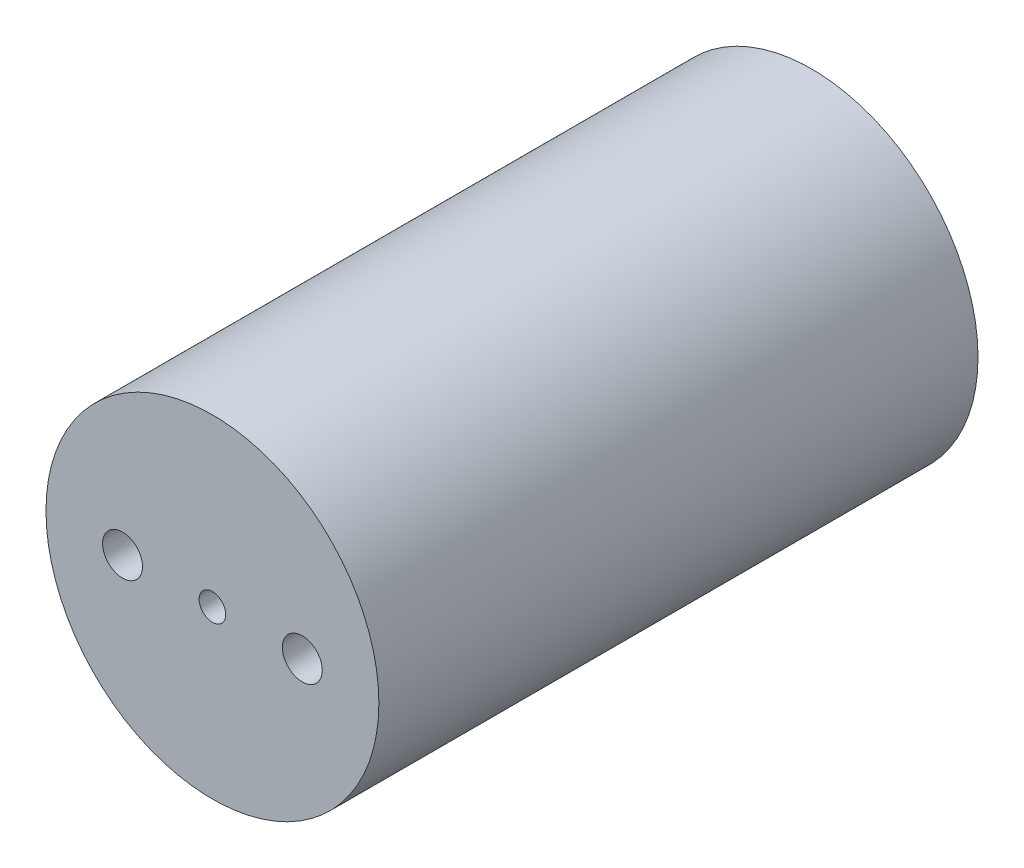
ISO-10303-21;
HEADER;
FILE_DESCRIPTION(('STEP AP214'),'2;1');
FILE_NAME('part.step','',(''),(''),'','','');
FILE_SCHEMA(('AUTOMOTIVE_DESIGN { 1 0 10303 214 1 1 1 1 }'));
ENDSEC;
DATA;
#1=APPLICATION_CONTEXT('core data for automotive mechanical design processes');
#2=APPLICATION_PROTOCOL_DEFINITION('international standard','automotive_design',2000,#1);
#3=PRODUCT_CONTEXT('',#1,'mechanical');
#4=PRODUCT('Part','Part','',(#3));
#5=PRODUCT_RELATED_PRODUCT_CATEGORY('part','',(#4));
#6=PRODUCT_DEFINITION_FORMATION('','',#4);
#7=PRODUCT_DEFINITION_CONTEXT('part definition',#1,'design');
#8=PRODUCT_DEFINITION('design','',#6,#7);
#9=PRODUCT_DEFINITION_SHAPE('','',#8);
#10=(LENGTH_UNIT() NAMED_UNIT(*) SI_UNIT(.MILLI.,.METRE.));
#11=(NAMED_UNIT(*) PLANE_ANGLE_UNIT() SI_UNIT($,.RADIAN.));
#12=(NAMED_UNIT(*) SI_UNIT($,.STERADIAN.) SOLID_ANGLE_UNIT());
#13=UNCERTAINTY_MEASURE_WITH_UNIT(LENGTH_MEASURE(1.E-05),#10,'distance_accuracy_value','');
#14=(GEOMETRIC_REPRESENTATION_CONTEXT(3) GLOBAL_UNCERTAINTY_ASSIGNED_CONTEXT((#13)) GLOBAL_UNIT_ASSIGNED_CONTEXT((#10,
#11,#12)) REPRESENTATION_CONTEXT('',''));
#15=CARTESIAN_POINT('',(0.,0.,0.));
#16=DIRECTION('',(0.,0.,1.));
#17=DIRECTION('',(1.,0.,0.));
#18=AXIS2_PLACEMENT_3D('',#15,#16,#17);
#19=CARTESIAN_POINT('',(0.,0.,180.));
#20=DIRECTION('',(0.,0.,1.));
#21=DIRECTION('',(1.,0.,0.));
#22=AXIS2_PLACEMENT_3D('',#19,#20,#21);
#23=PLANE('',#22);
#24=CARTESIAN_POINT('',(27.,0.,180.));
#25=DIRECTION('',(0.,0.,1.));
#26=DIRECTION('',(1.,0.,0.));
#27=AXIS2_PLACEMENT_3D('',#24,#25,#26);
#28=CIRCLE('',#27,6.);
#29=CARTESIAN_POINT('',(33.,0.,180.));
#30=VERTEX_POINT('',#29);
#31=EDGE_CURVE('E67',#30,#30,#28,.T.);
#32=ORIENTED_EDGE('',*,*,#31,.F.);
#33=EDGE_LOOP('',(#32));
#34=FACE_BOUND('',#33,.T.);
#35=CARTESIAN_POINT('',(-27.,0.,180.));
#36=DIRECTION('',(0.,0.,1.));
#37=DIRECTION('',(-1.,0.,0.));
#38=AXIS2_PLACEMENT_3D('',#35,#36,#37);
#39=CIRCLE('',#38,6.);
#40=CARTESIAN_POINT('',(-21.,0.,180.));
#41=VERTEX_POINT('',#40);
#42=EDGE_CURVE('E59',#41,#41,#39,.T.);
#43=ORIENTED_EDGE('',*,*,#42,.F.);
#44=EDGE_LOOP('',(#43));
#45=FACE_BOUND('',#44,.T.);
#46=CARTESIAN_POINT('',(0.,0.,180.));
#47=DIRECTION('',(0.,0.,1.));
#48=DIRECTION('',(1.,0.,0.));
#49=AXIS2_PLACEMENT_3D('',#46,#47,#48);
#50=CIRCLE('',#49,50.);
#51=CARTESIAN_POINT('',(-50.,0.,180.));
#52=VERTEX_POINT('',#51);
#53=EDGE_CURVE('E10',#52,#52,#50,.T.);
#54=ORIENTED_EDGE('',*,*,#53,.T.);
#55=EDGE_LOOP('',(#54));
#56=FACE_BOUND('',#55,.T.);
#57=CARTESIAN_POINT('',(0.,0.,180.));
#58=DIRECTION('',(0.,0.,1.));
#59=DIRECTION('',(1.,0.,0.));
#60=AXIS2_PLACEMENT_3D('',#57,#58,#59);
#61=CIRCLE('',#60,4.);
#62=CARTESIAN_POINT('',(-4.,0.,180.));
#63=VERTEX_POINT('',#62);
#64=EDGE_CURVE('E49',#63,#63,#61,.T.);
#65=ORIENTED_EDGE('',*,*,#64,.F.);
#66=EDGE_LOOP('',(#65));
#67=FACE_BOUND('',#66,.T.);
#68=ADVANCED_FACE('F36',(#34,#45,#56,#67),#23,.T.);
#69=CARTESIAN_POINT('',(0.,0.,0.));
#70=DIRECTION('',(0.,0.,1.));
#71=DIRECTION('',(1.,0.,0.));
#72=AXIS2_PLACEMENT_3D('',#69,#70,#71);
#73=PLANE('',#72);
#74=CARTESIAN_POINT('',(27.,0.,0.));
#75=DIRECTION('',(0.,0.,1.));
#76=DIRECTION('',(1.,0.,0.));
#77=AXIS2_PLACEMENT_3D('',#74,#75,#76);
#78=CIRCLE('',#77,6.);
#79=CARTESIAN_POINT('',(33.,0.,0.));
#80=VERTEX_POINT('',#79);
#81=EDGE_CURVE('E55',#80,#80,#78,.T.);
#82=ORIENTED_EDGE('',*,*,#81,.T.);
#83=EDGE_LOOP('',(#82));
#84=FACE_BOUND('',#83,.T.);
#85=CARTESIAN_POINT('',(-27.,0.,0.));
#86=DIRECTION('',(0.,0.,1.));
#87=DIRECTION('',(-1.,0.,0.));
#88=AXIS2_PLACEMENT_3D('',#85,#86,#87);
#89=CIRCLE('',#88,6.);
#90=CARTESIAN_POINT('',(-21.,0.,0.));
#91=VERTEX_POINT('',#90);
#92=EDGE_CURVE('E63',#91,#91,#89,.T.);
#93=ORIENTED_EDGE('',*,*,#92,.T.);
#94=EDGE_LOOP('',(#93));
#95=FACE_BOUND('',#94,.T.);
#96=CARTESIAN_POINT('',(0.,0.,0.));
#97=DIRECTION('',(0.,0.,1.));
#98=DIRECTION('',(1.,0.,0.));
#99=AXIS2_PLACEMENT_3D('',#96,#97,#98);
#100=CIRCLE('',#99,50.);
#101=CARTESIAN_POINT('',(-50.,0.,0.));
#102=VERTEX_POINT('',#101);
#103=EDGE_CURVE('E40',#102,#102,#100,.T.);
#104=ORIENTED_EDGE('',*,*,#103,.F.);
#105=EDGE_LOOP('',(#104));
#106=FACE_BOUND('',#105,.T.);
#107=CARTESIAN_POINT('',(0.,0.,0.));
#108=DIRECTION('',(0.,0.,1.));
#109=DIRECTION('',(1.,0.,0.));
#110=AXIS2_PLACEMENT_3D('',#107,#108,#109);
#111=CIRCLE('',#110,4.);
#112=CARTESIAN_POINT('',(-4.,0.,0.));
#113=VERTEX_POINT('',#112);
#114=EDGE_CURVE('E51',#113,#113,#111,.T.);
#115=ORIENTED_EDGE('',*,*,#114,.T.);
#116=EDGE_LOOP('',(#115));
#117=FACE_BOUND('',#116,.T.);
#118=ADVANCED_FACE('F75',(#84,#95,#106,#117),#73,.F.);
#119=CARTESIAN_POINT('',(0.,0.,180.));
#120=DIRECTION('',(0.,0.,-1.));
#121=DIRECTION('',(-1.,0.,0.));
#122=AXIS2_PLACEMENT_3D('',#119,#120,#121);
#123=CYLINDRICAL_SURFACE('',#122,50.);
#124=CARTESIAN_POINT('',(-50.,0.,180.));
#125=CARTESIAN_POINT('',(-50.,0.,178.125));
#126=CARTESIAN_POINT('',(-50.,0.,176.25));
#127=CARTESIAN_POINT('',(-50.,0.,172.5));
#128=CARTESIAN_POINT('',(-50.,0.,170.625));
#129=CARTESIAN_POINT('',(-50.,0.,166.875));
#130=CARTESIAN_POINT('',(-50.,0.,165.));
#131=CARTESIAN_POINT('',(-50.,0.,161.25));
#132=CARTESIAN_POINT('',(-50.,0.,159.375));
#133=CARTESIAN_POINT('',(-50.,0.,155.625));
#134=CARTESIAN_POINT('',(-50.,0.,153.75));
#135=CARTESIAN_POINT('',(-50.,0.,150.));
#136=CARTESIAN_POINT('',(-50.,0.,148.125));
#137=CARTESIAN_POINT('',(-50.,0.,144.375));
#138=CARTESIAN_POINT('',(-50.,0.,142.5));
#139=CARTESIAN_POINT('',(-50.,0.,138.75));
#140=CARTESIAN_POINT('',(-50.,0.,136.875));
#141=CARTESIAN_POINT('',(-50.,0.,133.125));
#142=CARTESIAN_POINT('',(-50.,0.,131.25));
#143=CARTESIAN_POINT('',(-50.,0.,127.5));
#144=CARTESIAN_POINT('',(-50.,0.,125.625));
#145=CARTESIAN_POINT('',(-50.,0.,121.875));
#146=CARTESIAN_POINT('',(-50.,0.,120.));
#147=CARTESIAN_POINT('',(-50.,0.,116.25));
#148=CARTESIAN_POINT('',(-50.,0.,114.375));
#149=CARTESIAN_POINT('',(-50.,0.,110.625));
#150=CARTESIAN_POINT('',(-50.,0.,108.75));
#151=CARTESIAN_POINT('',(-50.,0.,105.));
#152=CARTESIAN_POINT('',(-50.,0.,103.125));
#153=CARTESIAN_POINT('',(-50.,0.,99.375));
#154=CARTESIAN_POINT('',(-50.,0.,97.5));
#155=CARTESIAN_POINT('',(-50.,0.,93.75));
#156=CARTESIAN_POINT('',(-50.,0.,91.875));
#157=CARTESIAN_POINT('',(-50.,0.,88.125));
#158=CARTESIAN_POINT('',(-50.,0.,86.25));
#159=CARTESIAN_POINT('',(-50.,0.,82.5));
#160=CARTESIAN_POINT('',(-50.,0.,80.625));
#161=CARTESIAN_POINT('',(-50.,0.,76.875));
#162=CARTESIAN_POINT('',(-50.,0.,75.));
#163=CARTESIAN_POINT('',(-50.,0.,71.25));
#164=CARTESIAN_POINT('',(-50.,0.,69.375));
#165=CARTESIAN_POINT('',(-50.,0.,65.625));
#166=CARTESIAN_POINT('',(-50.,0.,63.75));
#167=CARTESIAN_POINT('',(-50.,0.,60.));
#168=CARTESIAN_POINT('',(-50.,0.,58.125));
#169=CARTESIAN_POINT('',(-50.,0.,54.375));
#170=CARTESIAN_POINT('',(-50.,0.,52.5));
#171=CARTESIAN_POINT('',(-50.,0.,48.75));
#172=CARTESIAN_POINT('',(-50.,0.,46.875));
#173=CARTESIAN_POINT('',(-50.,0.,43.125));
#174=CARTESIAN_POINT('',(-50.,0.,41.25));
#175=CARTESIAN_POINT('',(-50.,0.,37.5));
#176=CARTESIAN_POINT('',(-50.,0.,35.625));
#177=CARTESIAN_POINT('',(-50.,0.,31.875));
#178=CARTESIAN_POINT('',(-50.,0.,30.));
#179=CARTESIAN_POINT('',(-50.,0.,26.25));
#180=CARTESIAN_POINT('',(-50.,0.,24.375));
#181=CARTESIAN_POINT('',(-50.,0.,20.625));
#182=CARTESIAN_POINT('',(-50.,0.,18.75));
#183=CARTESIAN_POINT('',(-50.,0.,15.));
#184=CARTESIAN_POINT('',(-50.,0.,13.125));
#185=CARTESIAN_POINT('',(-50.,0.,9.37499999999998));
#186=CARTESIAN_POINT('',(-50.,0.,7.49999999999997));
#187=CARTESIAN_POINT('',(-50.,0.,3.74999999999997));
#188=CARTESIAN_POINT('',(-50.,0.,1.87499999999997));
#189=CARTESIAN_POINT('',(-50.,0.,0.));
#190=B_SPLINE_CURVE_WITH_KNOTS('',3,(#124,#125,#126,#127,#128,#129,#130,#131,#132,#133,#134,
#135,#136,#137,#138,#139,#140,#141,#142,#143,#144,#145,#146,#147,#148,#149,#150,#151,#152,#153,
#154,#155,#156,#157,#158,#159,#160,#161,#162,#163,#164,#165,#166,#167,#168,#169,#170,#171,#172,
#173,#174,#175,#176,#177,#178,#179,#180,#181,#182,#183,#184,#185,#186,#187,#188,#189),
.UNSPECIFIED.,.F.,.F.,(4,2,2,2,2,2,2,2,2,2,2,2,2,2,2,2,2,2,2,2,2,2,2,2,2,2,2,2,2,2,2,2,4),(0.,
5.62499999999999,11.25,16.875,22.5,28.125,33.75,39.375,45.,50.625,56.25,61.875,67.5,73.125,
78.75,84.375,90.,95.625,101.25,106.875,112.5,118.125,123.75,129.375,135.,140.625,146.25,151.875,
157.5,163.125,168.75,174.375,180.),.UNSPECIFIED.);
#191=EDGE_CURVE('BSEAM38',#52,#102,#190,.T.);
#192=ORIENTED_EDGE('',*,*,#53,.F.);
#193=ORIENTED_EDGE('',*,*,#103,.T.);
#194=ORIENTED_EDGE('',*,*,#191,.T.);
#195=ORIENTED_EDGE('',*,*,#191,.F.);
#196=EDGE_LOOP('',(#192,#194,#193,#195));
#197=FACE_BOUND('',#196,.T.);
#198=ADVANCED_FACE('F38',(#197),#123,.T.);
#199=CARTESIAN_POINT('',(0.,0.,180.));
#200=DIRECTION('',(0.,0.,-1.));
#201=DIRECTION('',(-1.,0.,0.));
#202=AXIS2_PLACEMENT_3D('',#199,#200,#201);
#203=CYLINDRICAL_SURFACE('',#202,4.);
#204=CARTESIAN_POINT('',(-4.,0.,180.));
#205=CARTESIAN_POINT('',(-4.,0.,178.125));
#206=CARTESIAN_POINT('',(-4.,0.,176.25));
#207=CARTESIAN_POINT('',(-4.,0.,172.5));
#208=CARTESIAN_POINT('',(-4.,0.,170.625));
#209=CARTESIAN_POINT('',(-4.,0.,166.875));
#210=CARTESIAN_POINT('',(-4.,0.,165.));
#211=CARTESIAN_POINT('',(-4.,0.,161.25));
#212=CARTESIAN_POINT('',(-4.,0.,159.375));
#213=CARTESIAN_POINT('',(-4.,0.,155.625));
#214=CARTESIAN_POINT('',(-4.,0.,153.75));
#215=CARTESIAN_POINT('',(-4.,0.,150.));
#216=CARTESIAN_POINT('',(-4.,0.,148.125));
#217=CARTESIAN_POINT('',(-4.,0.,144.375));
#218=CARTESIAN_POINT('',(-4.,0.,142.5));
#219=CARTESIAN_POINT('',(-4.,0.,138.75));
#220=CARTESIAN_POINT('',(-4.,0.,136.875));
#221=CARTESIAN_POINT('',(-4.,0.,133.125));
#222=CARTESIAN_POINT('',(-4.,0.,131.25));
#223=CARTESIAN_POINT('',(-4.,0.,127.5));
#224=CARTESIAN_POINT('',(-4.,0.,125.625));
#225=CARTESIAN_POINT('',(-4.,0.,121.875));
#226=CARTESIAN_POINT('',(-4.,0.,120.));
#227=CARTESIAN_POINT('',(-4.,0.,116.25));
#228=CARTESIAN_POINT('',(-4.,0.,114.375));
#229=CARTESIAN_POINT('',(-4.,0.,110.625));
#230=CARTESIAN_POINT('',(-4.,0.,108.75));
#231=CARTESIAN_POINT('',(-4.,0.,105.));
#232=CARTESIAN_POINT('',(-4.,0.,103.125));
#233=CARTESIAN_POINT('',(-4.,0.,99.375));
#234=CARTESIAN_POINT('',(-4.,0.,97.5));
#235=CARTESIAN_POINT('',(-4.,0.,93.75));
#236=CARTESIAN_POINT('',(-4.,0.,91.875));
#237=CARTESIAN_POINT('',(-4.,0.,88.125));
#238=CARTESIAN_POINT('',(-4.,0.,86.25));
#239=CARTESIAN_POINT('',(-4.,0.,82.5));
#240=CARTESIAN_POINT('',(-4.,0.,80.625));
#241=CARTESIAN_POINT('',(-4.,0.,76.875));
#242=CARTESIAN_POINT('',(-4.,0.,75.));
#243=CARTESIAN_POINT('',(-4.,0.,71.25));
#244=CARTESIAN_POINT('',(-4.,0.,69.375));
#245=CARTESIAN_POINT('',(-4.,0.,65.625));
#246=CARTESIAN_POINT('',(-4.,0.,63.75));
#247=CARTESIAN_POINT('',(-4.,0.,60.));
#248=CARTESIAN_POINT('',(-4.,0.,58.125));
#249=CARTESIAN_POINT('',(-4.,0.,54.375));
#250=CARTESIAN_POINT('',(-4.,0.,52.5));
#251=CARTESIAN_POINT('',(-4.,0.,48.75));
#252=CARTESIAN_POINT('',(-4.,0.,46.875));
#253=CARTESIAN_POINT('',(-4.,0.,43.125));
#254=CARTESIAN_POINT('',(-4.,0.,41.25));
#255=CARTESIAN_POINT('',(-4.,0.,37.5));
#256=CARTESIAN_POINT('',(-4.,0.,35.625));
#257=CARTESIAN_POINT('',(-4.,0.,31.875));
#258=CARTESIAN_POINT('',(-4.,0.,30.));
#259=CARTESIAN_POINT('',(-4.,0.,26.25));
#260=CARTESIAN_POINT('',(-4.,0.,24.375));
#261=CARTESIAN_POINT('',(-4.,0.,20.625));
#262=CARTESIAN_POINT('',(-4.,0.,18.75));
#263=CARTESIAN_POINT('',(-4.,0.,15.));
#264=CARTESIAN_POINT('',(-4.,0.,13.125));
#265=CARTESIAN_POINT('',(-4.,0.,9.37499999999998));
#266=CARTESIAN_POINT('',(-4.,0.,7.49999999999997));
#267=CARTESIAN_POINT('',(-4.,0.,3.74999999999997));
#268=CARTESIAN_POINT('',(-4.,0.,1.87499999999997));
#269=CARTESIAN_POINT('',(-4.,0.,0.));
#270=B_SPLINE_CURVE_WITH_KNOTS('',3,(#204,#205,#206,#207,#208,#209,#210,#211,#212,#213,#214,
#215,#216,#217,#218,#219,#220,#221,#222,#223,#224,#225,#226,#227,#228,#229,#230,#231,#232,#233,
#234,#235,#236,#237,#238,#239,#240,#241,#242,#243,#244,#245,#246,#247,#248,#249,#250,#251,#252,
#253,#254,#255,#256,#257,#258,#259,#260,#261,#262,#263,#264,#265,#266,#267,#268,#269),
.UNSPECIFIED.,.F.,.F.,(4,2,2,2,2,2,2,2,2,2,2,2,2,2,2,2,2,2,2,2,2,2,2,2,2,2,2,2,2,2,2,2,4),(0.,
5.62499999999999,11.25,16.875,22.5,28.125,33.75,39.375,45.,50.625,56.25,61.875,67.5,73.125,
78.75,84.375,90.,95.625,101.25,106.875,112.5,118.125,123.75,129.375,135.,140.625,146.25,151.875,
157.5,163.125,168.75,174.375,180.),.UNSPECIFIED.);
#271=EDGE_CURVE('BSEAM92',#63,#113,#270,.T.);
#272=ORIENTED_EDGE('',*,*,#64,.T.);
#273=ORIENTED_EDGE('',*,*,#114,.F.);
#274=ORIENTED_EDGE('',*,*,#271,.T.);
#275=ORIENTED_EDGE('',*,*,#271,.F.);
#276=EDGE_LOOP('',(#272,#274,#273,#275));
#277=FACE_BOUND('',#276,.T.);
#278=ADVANCED_FACE('F92',(#277),#203,.F.);
#279=CARTESIAN_POINT('',(-27.,0.,0.));
#280=DIRECTION('',(0.,0.,1.));
#281=DIRECTION('',(1.,0.,0.));
#282=AXIS2_PLACEMENT_3D('',#279,#280,#281);
#283=CYLINDRICAL_SURFACE('',#282,6.);
#284=CARTESIAN_POINT('',(-21.,0.,0.));
#285=CARTESIAN_POINT('',(-21.,0.,1.875));
#286=CARTESIAN_POINT('',(-21.,0.,3.75));
#287=CARTESIAN_POINT('',(-21.,0.,7.5));
#288=CARTESIAN_POINT('',(-21.,0.,9.375));
#289=CARTESIAN_POINT('',(-21.,0.,13.125));
#290=CARTESIAN_POINT('',(-21.,0.,15.));
#291=CARTESIAN_POINT('',(-21.,0.,18.75));
#292=CARTESIAN_POINT('',(-21.,0.,20.625));
#293=CARTESIAN_POINT('',(-21.,0.,24.375));
#294=CARTESIAN_POINT('',(-21.,0.,26.25));
#295=CARTESIAN_POINT('',(-21.,0.,30.));
#296=CARTESIAN_POINT('',(-21.,0.,31.875));
#297=CARTESIAN_POINT('',(-21.,0.,35.625));
#298=CARTESIAN_POINT('',(-21.,0.,37.5));
#299=CARTESIAN_POINT('',(-21.,0.,41.25));
#300=CARTESIAN_POINT('',(-21.,0.,43.125));
#301=CARTESIAN_POINT('',(-21.,0.,46.875));
#302=CARTESIAN_POINT('',(-21.,0.,48.75));
#303=CARTESIAN_POINT('',(-21.,0.,52.5));
#304=CARTESIAN_POINT('',(-21.,0.,54.375));
#305=CARTESIAN_POINT('',(-21.,0.,58.125));
#306=CARTESIAN_POINT('',(-21.,0.,60.));
#307=CARTESIAN_POINT('',(-21.,0.,63.75));
#308=CARTESIAN_POINT('',(-21.,0.,65.625));
#309=CARTESIAN_POINT('',(-21.,0.,69.375));
#310=CARTESIAN_POINT('',(-21.,0.,71.25));
#311=CARTESIAN_POINT('',(-21.,0.,75.));
#312=CARTESIAN_POINT('',(-21.,0.,76.875));
#313=CARTESIAN_POINT('',(-21.,0.,80.625));
#314=CARTESIAN_POINT('',(-21.,0.,82.5));
#315=CARTESIAN_POINT('',(-21.,0.,86.25));
#316=CARTESIAN_POINT('',(-21.,0.,88.125));
#317=CARTESIAN_POINT('',(-21.,0.,91.875));
#318=CARTESIAN_POINT('',(-21.,0.,93.75));
#319=CARTESIAN_POINT('',(-21.,0.,97.5));
#320=CARTESIAN_POINT('',(-21.,0.,99.375));
#321=CARTESIAN_POINT('',(-21.,0.,103.125));
#322=CARTESIAN_POINT('',(-21.,0.,105.));
#323=CARTESIAN_POINT('',(-21.,0.,108.75));
#324=CARTESIAN_POINT('',(-21.,0.,110.625));
#325=CARTESIAN_POINT('',(-21.,0.,114.375));
#326=CARTESIAN_POINT('',(-21.,0.,116.25));
#327=CARTESIAN_POINT('',(-21.,0.,120.));
#328=CARTESIAN_POINT('',(-21.,0.,121.875));
#329=CARTESIAN_POINT('',(-21.,0.,125.625));
#330=CARTESIAN_POINT('',(-21.,0.,127.5));
#331=CARTESIAN_POINT('',(-21.,0.,131.25));
#332=CARTESIAN_POINT('',(-21.,0.,133.125));
#333=CARTESIAN_POINT('',(-21.,0.,136.875));
#334=CARTESIAN_POINT('',(-21.,0.,138.75));
#335=CARTESIAN_POINT('',(-21.,0.,142.5));
#336=CARTESIAN_POINT('',(-21.,0.,144.375));
#337=CARTESIAN_POINT('',(-21.,0.,148.125));
#338=CARTESIAN_POINT('',(-21.,0.,150.));
#339=CARTESIAN_POINT('',(-21.,0.,153.75));
#340=CARTESIAN_POINT('',(-21.,0.,155.625));
#341=CARTESIAN_POINT('',(-21.,0.,159.375));
#342=CARTESIAN_POINT('',(-21.,0.,161.25));
#343=CARTESIAN_POINT('',(-21.,0.,165.));
#344=CARTESIAN_POINT('',(-21.,0.,166.875));
#345=CARTESIAN_POINT('',(-21.,0.,170.625));
#346=CARTESIAN_POINT('',(-21.,0.,172.5));
#347=CARTESIAN_POINT('',(-21.,0.,176.25));
#348=CARTESIAN_POINT('',(-21.,0.,178.125));
#349=CARTESIAN_POINT('',(-21.,0.,180.));
#350=B_SPLINE_CURVE_WITH_KNOTS('',3,(#284,#285,#286,#287,#288,#289,#290,#291,#292,#293,#294,
#295,#296,#297,#298,#299,#300,#301,#302,#303,#304,#305,#306,#307,#308,#309,#310,#311,#312,#313,
#314,#315,#316,#317,#318,#319,#320,#321,#322,#323,#324,#325,#326,#327,#328,#329,#330,#331,#332,
#333,#334,#335,#336,#337,#338,#339,#340,#341,#342,#343,#344,#345,#346,#347,#348,#349),
.UNSPECIFIED.,.F.,.F.,(4,2,2,2,2,2,2,2,2,2,2,2,2,2,2,2,2,2,2,2,2,2,2,2,2,2,2,2,2,2,2,2,4),(0.,
5.625,11.25,16.875,22.5,28.125,33.75,39.375,45.,50.625,56.25,61.875,67.5,73.125,78.75,84.375,
90.,95.625,101.25,106.875,112.5,118.125,123.75,129.375,135.,140.625,146.25,151.875,157.5,
163.125,168.75,174.375,180.),.UNSPECIFIED.);
#351=EDGE_CURVE('BSEAM81',#91,#41,#350,.T.);
#352=ORIENTED_EDGE('',*,*,#92,.F.);
#353=ORIENTED_EDGE('',*,*,#42,.T.);
#354=ORIENTED_EDGE('',*,*,#351,.T.);
#355=ORIENTED_EDGE('',*,*,#351,.F.);
#356=EDGE_LOOP('',(#352,#354,#353,#355));
#357=FACE_BOUND('',#356,.T.);
#358=ADVANCED_FACE('F81',(#357),#283,.F.);
#359=CARTESIAN_POINT('',(27.,0.,0.));
#360=DIRECTION('',(0.,0.,1.));
#361=DIRECTION('',(1.,0.,0.));
#362=AXIS2_PLACEMENT_3D('',#359,#360,#361);
#363=CYLINDRICAL_SURFACE('',#362,6.);
#364=CARTESIAN_POINT('',(33.,0.,0.));
#365=CARTESIAN_POINT('',(33.,0.,1.875));
#366=CARTESIAN_POINT('',(33.,0.,3.75));
#367=CARTESIAN_POINT('',(33.,0.,7.5));
#368=CARTESIAN_POINT('',(33.,0.,9.375));
#369=CARTESIAN_POINT('',(33.,0.,13.125));
#370=CARTESIAN_POINT('',(33.,0.,15.));
#371=CARTESIAN_POINT('',(33.,0.,18.75));
#372=CARTESIAN_POINT('',(33.,0.,20.625));
#373=CARTESIAN_POINT('',(33.,0.,24.375));
#374=CARTESIAN_POINT('',(33.,0.,26.25));
#375=CARTESIAN_POINT('',(33.,0.,30.));
#376=CARTESIAN_POINT('',(33.,0.,31.875));
#377=CARTESIAN_POINT('',(33.,0.,35.625));
#378=CARTESIAN_POINT('',(33.,0.,37.5));
#379=CARTESIAN_POINT('',(33.,0.,41.25));
#380=CARTESIAN_POINT('',(33.,0.,43.125));
#381=CARTESIAN_POINT('',(33.,0.,46.875));
#382=CARTESIAN_POINT('',(33.,0.,48.75));
#383=CARTESIAN_POINT('',(33.,0.,52.5));
#384=CARTESIAN_POINT('',(33.,0.,54.375));
#385=CARTESIAN_POINT('',(33.,0.,58.125));
#386=CARTESIAN_POINT('',(33.,0.,60.));
#387=CARTESIAN_POINT('',(33.,0.,63.75));
#388=CARTESIAN_POINT('',(33.,0.,65.625));
#389=CARTESIAN_POINT('',(33.,0.,69.375));
#390=CARTESIAN_POINT('',(33.,0.,71.25));
#391=CARTESIAN_POINT('',(33.,0.,75.));
#392=CARTESIAN_POINT('',(33.,0.,76.875));
#393=CARTESIAN_POINT('',(33.,0.,80.625));
#394=CARTESIAN_POINT('',(33.,0.,82.5));
#395=CARTESIAN_POINT('',(33.,0.,86.25));
#396=CARTESIAN_POINT('',(33.,0.,88.125));
#397=CARTESIAN_POINT('',(33.,0.,91.875));
#398=CARTESIAN_POINT('',(33.,0.,93.75));
#399=CARTESIAN_POINT('',(33.,0.,97.5));
#400=CARTESIAN_POINT('',(33.,0.,99.375));
#401=CARTESIAN_POINT('',(33.,0.,103.125));
#402=CARTESIAN_POINT('',(33.,0.,105.));
#403=CARTESIAN_POINT('',(33.,0.,108.75));
#404=CARTESIAN_POINT('',(33.,0.,110.625));
#405=CARTESIAN_POINT('',(33.,0.,114.375));
#406=CARTESIAN_POINT('',(33.,0.,116.25));
#407=CARTESIAN_POINT('',(33.,0.,120.));
#408=CARTESIAN_POINT('',(33.,0.,121.875));
#409=CARTESIAN_POINT('',(33.,0.,125.625));
#410=CARTESIAN_POINT('',(33.,0.,127.5));
#411=CARTESIAN_POINT('',(33.,0.,131.25));
#412=CARTESIAN_POINT('',(33.,0.,133.125));
#413=CARTESIAN_POINT('',(33.,0.,136.875));
#414=CARTESIAN_POINT('',(33.,0.,138.75));
#415=CARTESIAN_POINT('',(33.,0.,142.5));
#416=CARTESIAN_POINT('',(33.,0.,144.375));
#417=CARTESIAN_POINT('',(33.,0.,148.125));
#418=CARTESIAN_POINT('',(33.,0.,150.));
#419=CARTESIAN_POINT('',(33.,0.,153.75));
#420=CARTESIAN_POINT('',(33.,0.,155.625));
#421=CARTESIAN_POINT('',(33.,0.,159.375));
#422=CARTESIAN_POINT('',(33.,0.,161.25));
#423=CARTESIAN_POINT('',(33.,0.,165.));
#424=CARTESIAN_POINT('',(33.,0.,166.875));
#425=CARTESIAN_POINT('',(33.,0.,170.625));
#426=CARTESIAN_POINT('',(33.,0.,172.5));
#427=CARTESIAN_POINT('',(33.,0.,176.25));
#428=CARTESIAN_POINT('',(33.,0.,178.125));
#429=CARTESIAN_POINT('',(33.,0.,180.));
#430=B_SPLINE_CURVE_WITH_KNOTS('',3,(#364,#365,#366,#367,#368,#369,#370,#371,#372,#373,#374,
#375,#376,#377,#378,#379,#380,#381,#382,#383,#384,#385,#386,#387,#388,#389,#390,#391,#392,#393,
#394,#395,#396,#397,#398,#399,#400,#401,#402,#403,#404,#405,#406,#407,#408,#409,#410,#411,#412,
#413,#414,#415,#416,#417,#418,#419,#420,#421,#422,#423,#424,#425,#426,#427,#428,#429),
.UNSPECIFIED.,.F.,.F.,(4,2,2,2,2,2,2,2,2,2,2,2,2,2,2,2,2,2,2,2,2,2,2,2,2,2,2,2,2,2,2,2,4),(0.,
5.625,11.25,16.875,22.5,28.125,33.75,39.375,45.,50.625,56.25,61.875,67.5,73.125,78.75,84.375,
90.,95.625,101.25,106.875,112.5,118.125,123.75,129.375,135.,140.625,146.25,151.875,157.5,
163.125,168.75,174.375,180.),.UNSPECIFIED.);
#431=EDGE_CURVE('BSEAM78',#80,#30,#430,.T.);
#432=ORIENTED_EDGE('',*,*,#81,.F.);
#433=ORIENTED_EDGE('',*,*,#31,.T.);
#434=ORIENTED_EDGE('',*,*,#431,.T.);
#435=ORIENTED_EDGE('',*,*,#431,.F.);
#436=EDGE_LOOP('',(#432,#434,#433,#435));
#437=FACE_BOUND('',#436,.T.);
#438=ADVANCED_FACE('F78',(#437),#363,.F.);
#439=CLOSED_SHELL('',(#68,#118,#198,#278,#358,#438));
#440=MANIFOLD_SOLID_BREP('B2',#439);
#441=ADVANCED_BREP_SHAPE_REPRESENTATION('',(#18,#440),#14);
#442=SHAPE_DEFINITION_REPRESENTATION(#9,#441);
ENDSEC;
END-ISO-10303-21;
